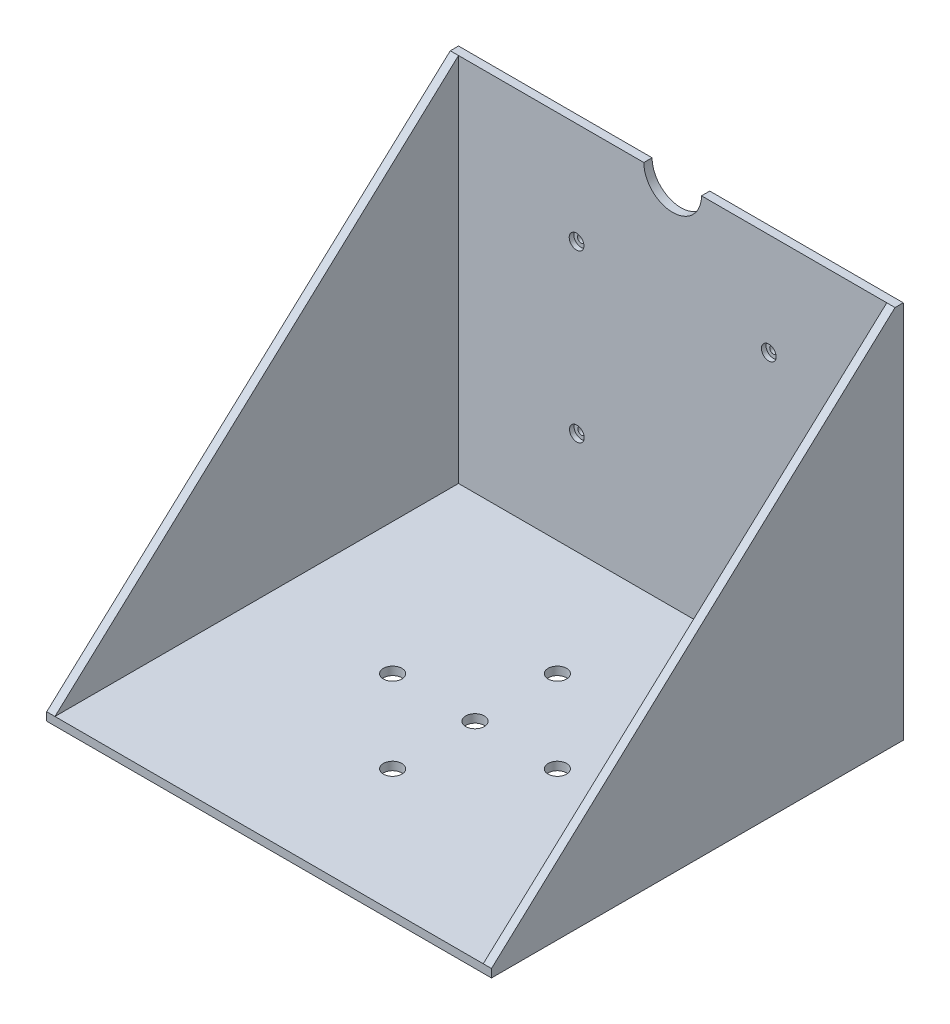
ISO-10303-21;
HEADER;
FILE_DESCRIPTION(('STEP AP214'),'2;1');
FILE_NAME('part.step','',(''),(''),'','','');
FILE_SCHEMA(('AUTOMOTIVE_DESIGN { 1 0 10303 214 1 1 1 1 }'));
ENDSEC;
DATA;
#1=APPLICATION_CONTEXT('core data for automotive mechanical design processes');
#2=APPLICATION_PROTOCOL_DEFINITION('international standard','automotive_design',2000,#1);
#3=PRODUCT_CONTEXT('',#1,'mechanical');
#4=PRODUCT('Part','Part','',(#3));
#5=PRODUCT_RELATED_PRODUCT_CATEGORY('part','',(#4));
#6=PRODUCT_DEFINITION_FORMATION('','',#4);
#7=PRODUCT_DEFINITION_CONTEXT('part definition',#1,'design');
#8=PRODUCT_DEFINITION('design','',#6,#7);
#9=PRODUCT_DEFINITION_SHAPE('','',#8);
#10=(LENGTH_UNIT() NAMED_UNIT(*) SI_UNIT(.MILLI.,.METRE.));
#11=(NAMED_UNIT(*) PLANE_ANGLE_UNIT() SI_UNIT($,.RADIAN.));
#12=(NAMED_UNIT(*) SI_UNIT($,.STERADIAN.) SOLID_ANGLE_UNIT());
#13=UNCERTAINTY_MEASURE_WITH_UNIT(LENGTH_MEASURE(1.E-05),#10,'distance_accuracy_value','');
#14=(GEOMETRIC_REPRESENTATION_CONTEXT(3) GLOBAL_UNCERTAINTY_ASSIGNED_CONTEXT((#13)) GLOBAL_UNIT_ASSIGNED_CONTEXT((#10,
#11,#12)) REPRESENTATION_CONTEXT('',''));
#15=CARTESIAN_POINT('',(0.,0.,0.));
#16=DIRECTION('',(0.,0.,1.));
#17=DIRECTION('',(1.,0.,0.));
#18=AXIS2_PLACEMENT_3D('',#15,#16,#17);
#19=CARTESIAN_POINT('',(0.,2.,0.));
#20=DIRECTION('',(0.,1.,0.));
#21=DIRECTION('',(0.,0.,1.));
#22=AXIS2_PLACEMENT_3D('',#19,#20,#21);
#23=PLANE('',#22);
#24=CARTESIAN_POINT('',(0.,2.,-20.));
#25=DIRECTION('',(0.,1.,0.));
#26=DIRECTION('',(0.,0.,1.));
#27=AXIS2_PLACEMENT_3D('',#24,#25,#26);
#28=CIRCLE('',#27,2.24999999999999);
#29=CARTESIAN_POINT('',(0.,2.,-17.75));
#30=VERTEX_POINT('',#29);
#31=EDGE_CURVE('E164',#30,#30,#28,.T.);
#32=ORIENTED_EDGE('',*,*,#31,.F.);
#33=EDGE_LOOP('',(#32));
#34=FACE_BOUND('',#33,.T.);
#35=CARTESIAN_POINT('',(20.,2.,0.));
#36=DIRECTION('',(0.,1.,0.));
#37=DIRECTION('',(0.,0.,1.));
#38=AXIS2_PLACEMENT_3D('',#35,#36,#37);
#39=CIRCLE('',#38,2.24999999999999);
#40=CARTESIAN_POINT('',(20.,2.,2.24999999999999));
#41=VERTEX_POINT('',#40);
#42=EDGE_CURVE('E170',#41,#41,#39,.T.);
#43=ORIENTED_EDGE('',*,*,#42,.F.);
#44=EDGE_LOOP('',(#43));
#45=FACE_BOUND('',#44,.T.);
#46=CARTESIAN_POINT('',(0.,2.,20.));
#47=DIRECTION('',(0.,1.,0.));
#48=DIRECTION('',(0.,0.,1.));
#49=AXIS2_PLACEMENT_3D('',#46,#47,#48);
#50=CIRCLE('',#49,2.24999999999999);
#51=CARTESIAN_POINT('',(0.,2.,22.25));
#52=VERTEX_POINT('',#51);
#53=EDGE_CURVE('E176',#52,#52,#50,.T.);
#54=ORIENTED_EDGE('',*,*,#53,.F.);
#55=EDGE_LOOP('',(#54));
#56=FACE_BOUND('',#55,.T.);
#57=CARTESIAN_POINT('',(-20.,2.,0.));
#58=DIRECTION('',(0.,1.,0.));
#59=DIRECTION('',(0.,0.,1.));
#60=AXIS2_PLACEMENT_3D('',#57,#58,#59);
#61=CIRCLE('',#60,2.24999999999999);
#62=CARTESIAN_POINT('',(-20.,2.,2.24999999999999));
#63=VERTEX_POINT('',#62);
#64=EDGE_CURVE('E182',#63,#63,#61,.T.);
#65=ORIENTED_EDGE('',*,*,#64,.F.);
#66=EDGE_LOOP('',(#65));
#67=FACE_BOUND('',#66,.T.);
#68=CARTESIAN_POINT('',(0.,2.,0.));
#69=DIRECTION('',(0.,1.,0.));
#70=DIRECTION('',(0.,0.,1.));
#71=AXIS2_PLACEMENT_3D('',#68,#69,#70);
#72=CIRCLE('',#71,2.24999999999999);
#73=CARTESIAN_POINT('',(0.,2.,2.24999999999999));
#74=VERTEX_POINT('',#73);
#75=EDGE_CURVE('E186',#74,#74,#72,.T.);
#76=ORIENTED_EDGE('',*,*,#75,.F.);
#77=EDGE_LOOP('',(#76));
#78=FACE_BOUND('',#77,.T.);
#79=DIRECTION('',(-1.,0.,0.));
#80=VECTOR('',#79,1.);
#81=CARTESIAN_POINT('',(0.,2.,-48.));
#82=LINE('',#81,#80);
#83=CARTESIAN_POINT('',(52.,2.,-48.));
#84=VERTEX_POINT('',#83);
#85=CARTESIAN_POINT('',(-52.,2.,-48.));
#86=VERTEX_POINT('',#85);
#87=EDGE_CURVE('E138',#84,#86,#82,.T.);
#88=ORIENTED_EDGE('',*,*,#87,.T.);
#89=DIRECTION('',(0.,0.,1.));
#90=VECTOR('',#89,1.);
#91=CARTESIAN_POINT('',(-52.,2.,50.));
#92=LINE('',#91,#90);
#93=CARTESIAN_POINT('',(-52.,2.,50.));
#94=VERTEX_POINT('',#93);
#95=EDGE_CURVE('E60',#86,#94,#92,.T.);
#96=ORIENTED_EDGE('',*,*,#95,.T.);
#97=DIRECTION('',(1.,0.,0.));
#98=VECTOR('',#97,1.);
#99=CARTESIAN_POINT('',(54.,2.,50.));
#100=LINE('',#99,#98);
#101=CARTESIAN_POINT('',(52.,2.,50.));
#102=VERTEX_POINT('',#101);
#103=EDGE_CURVE('E206',#94,#102,#100,.T.);
#104=ORIENTED_EDGE('',*,*,#103,.T.);
#105=DIRECTION('',(0.,0.,-1.));
#106=VECTOR('',#105,1.);
#107=CARTESIAN_POINT('',(52.,2.,50.));
#108=LINE('',#107,#106);
#109=EDGE_CURVE('E152',#102,#84,#108,.T.);
#110=ORIENTED_EDGE('',*,*,#109,.T.);
#111=EDGE_LOOP('',(#88,#96,#104,#110));
#112=FACE_BOUND('',#111,.T.);
#113=ADVANCED_FACE('F43',(#34,#45,#56,#67,#78,#112),#23,.T.);
#114=CARTESIAN_POINT('',(0.,92.,-48.));
#115=DIRECTION('',(0.,0.,1.));
#116=DIRECTION('',(1.,0.,0.));
#117=AXIS2_PLACEMENT_3D('',#114,#115,#116);
#118=PLANE('',#117);
#119=CARTESIAN_POINT('',(-23.3352416469861,67.1939591175841,-48.));
#120=DIRECTION('',(0.,0.,1.));
#121=DIRECTION('',(1.,0.,0.));
#122=AXIS2_PLACEMENT_3D('',#119,#120,#121);
#123=CIRCLE('',#122,1.78561999999999);
#124=CARTESIAN_POINT('',(-21.5496216469861,67.1939591175841,-48.));
#125=VERTEX_POINT('',#124);
#126=EDGE_CURVE('E615',#125,#125,#123,.T.);
#127=ORIENTED_EDGE('',*,*,#126,.F.);
#128=EDGE_LOOP('',(#127));
#129=FACE_BOUND('',#128,.T.);
#130=CARTESIAN_POINT('',(23.3407645603034,67.198738561801,-48.));
#131=DIRECTION('',(0.,0.,1.));
#132=DIRECTION('',(1.,0.,0.));
#133=AXIS2_PLACEMENT_3D('',#130,#131,#132);
#134=CIRCLE('',#133,1.78561999999999);
#135=CARTESIAN_POINT('',(25.1263845603034,67.198738561801,-48.));
#136=VERTEX_POINT('',#135);
#137=EDGE_CURVE('E253',#136,#136,#134,.T.);
#138=ORIENTED_EDGE('',*,*,#137,.F.);
#139=EDGE_LOOP('',(#138));
#140=FACE_BOUND('',#139,.T.);
#141=CARTESIAN_POINT('',(-23.269344276744,26.8630674528177,-48.));
#142=DIRECTION('',(0.,0.,1.));
#143=DIRECTION('',(1.,0.,0.));
#144=AXIS2_PLACEMENT_3D('',#141,#142,#143);
#145=CIRCLE('',#144,1.78561999999999);
#146=CARTESIAN_POINT('',(-21.483724276744,26.8630674528177,-48.));
#147=VERTEX_POINT('',#146);
#148=EDGE_CURVE('E240',#147,#147,#145,.T.);
#149=ORIENTED_EDGE('',*,*,#148,.F.);
#150=EDGE_LOOP('',(#149));
#151=FACE_BOUND('',#150,.T.);
#152=CARTESIAN_POINT('',(23.1813509487763,26.9392155250974,-48.));
#153=DIRECTION('',(0.,0.,1.));
#154=DIRECTION('',(1.,0.,0.));
#155=AXIS2_PLACEMENT_3D('',#152,#153,#154);
#156=CIRCLE('',#155,1.78561999999999);
#157=CARTESIAN_POINT('',(24.9669709487763,26.9392155250974,-48.));
#158=VERTEX_POINT('',#157);
#159=EDGE_CURVE('E236',#158,#158,#156,.T.);
#160=ORIENTED_EDGE('',*,*,#159,.F.);
#161=EDGE_LOOP('',(#160));
#162=FACE_BOUND('',#161,.T.);
#163=DIRECTION('',(-1.,0.,0.));
#164=VECTOR('',#163,1.);
#165=CARTESIAN_POINT('',(0.,92.,-48.));
#166=LINE('',#165,#164);
#167=CARTESIAN_POINT('',(-7.,92.,-48.));
#168=VERTEX_POINT('',#167);
#169=CARTESIAN_POINT('',(-52.,92.,-48.));
#170=VERTEX_POINT('',#169);
#171=EDGE_CURVE('E133',#168,#170,#166,.T.);
#172=ORIENTED_EDGE('',*,*,#171,.T.);
#173=DIRECTION('',(0.,-1.,0.));
#174=VECTOR('',#173,1.);
#175=CARTESIAN_POINT('',(-52.,2.,-48.));
#176=LINE('',#175,#174);
#177=EDGE_CURVE('E68',#170,#86,#176,.T.);
#178=ORIENTED_EDGE('',*,*,#177,.T.);
#179=ORIENTED_EDGE('',*,*,#87,.F.);
#180=DIRECTION('',(0.,1.,0.));
#181=VECTOR('',#180,1.);
#182=CARTESIAN_POINT('',(52.,2.,-48.));
#183=LINE('',#182,#181);
#184=CARTESIAN_POINT('',(52.,92.,-48.));
#185=VERTEX_POINT('',#184);
#186=EDGE_CURVE('E136',#84,#185,#183,.T.);
#187=ORIENTED_EDGE('',*,*,#186,.T.);
#188=CARTESIAN_POINT('',(7.,92.,-48.));
#189=VERTEX_POINT('',#188);
#190=EDGE_CURVE('E123',#185,#189,#166,.T.);
#191=ORIENTED_EDGE('',*,*,#190,.T.);
#192=CARTESIAN_POINT('',(0.,92.,-48.));
#193=DIRECTION('',(0.,0.,1.));
#194=DIRECTION('',(1.,0.,0.));
#195=AXIS2_PLACEMENT_3D('',#192,#193,#194);
#196=CIRCLE('',#195,7.);
#197=EDGE_CURVE('E189',#168,#189,#196,.T.);
#198=ORIENTED_EDGE('',*,*,#197,.F.);
#199=EDGE_LOOP('',(#172,#178,#179,#187,#191,#198));
#200=FACE_BOUND('',#199,.T.);
#201=ADVANCED_FACE('F137',(#129,#140,#151,#162,#200),#118,.T.);
#202=CARTESIAN_POINT('',(0.,92.,0.));
#203=DIRECTION('',(0.,1.,0.));
#204=DIRECTION('',(0.,0.,1.));
#205=AXIS2_PLACEMENT_3D('',#202,#203,#204);
#206=PLANE('',#205);
#207=DIRECTION('',(0.,0.,1.));
#208=VECTOR('',#207,1.);
#209=CARTESIAN_POINT('',(-7.,92.,-138.));
#210=LINE('',#209,#208);
#211=CARTESIAN_POINT('',(-7.,92.,-50.));
#212=VERTEX_POINT('',#211);
#213=EDGE_CURVE('E11',#212,#168,#210,.T.);
#214=ORIENTED_EDGE('',*,*,#213,.F.);
#215=DIRECTION('',(-1.,0.,0.));
#216=VECTOR('',#215,1.);
#217=CARTESIAN_POINT('',(0.,92.,-50.));
#218=LINE('',#217,#216);
#219=CARTESIAN_POINT('',(-54.,92.,-50.));
#220=VERTEX_POINT('',#219);
#221=EDGE_CURVE('E195',#212,#220,#218,.T.);
#222=ORIENTED_EDGE('',*,*,#221,.T.);
#223=DIRECTION('',(0.,0.,1.));
#224=VECTOR('',#223,1.);
#225=CARTESIAN_POINT('',(-54.,92.,0.));
#226=LINE('',#225,#224);
#227=CARTESIAN_POINT('',(-54.,92.,-48.));
#228=VERTEX_POINT('',#227);
#229=EDGE_CURVE('E198',#220,#228,#226,.T.);
#230=ORIENTED_EDGE('',*,*,#229,.T.);
#231=DIRECTION('',(-1.,0.,0.));
#232=VECTOR('',#231,1.);
#233=CARTESIAN_POINT('',(-52.,92.,-48.));
#234=LINE('',#233,#232);
#235=EDGE_CURVE('E159',#170,#228,#234,.T.);
#236=ORIENTED_EDGE('',*,*,#235,.F.);
#237=ORIENTED_EDGE('',*,*,#171,.F.);
#238=EDGE_LOOP('',(#214,#222,#230,#236,#237));
#239=FACE_BOUND('',#238,.T.);
#240=ADVANCED_FACE('F309',(#239),#206,.T.);
#241=CARTESIAN_POINT('',(-54.,2.,50.));
#242=DIRECTION('',(1.,0.,0.));
#243=DIRECTION('',(0.,0.,-1.));
#244=AXIS2_PLACEMENT_3D('',#241,#242,#243);
#245=PLANE('',#244);
#246=DIRECTION('',(0.,-1.,0.));
#247=VECTOR('',#246,1.);
#248=CARTESIAN_POINT('',(-54.,2.,50.));
#249=LINE('',#248,#247);
#250=CARTESIAN_POINT('',(-54.,2.,50.));
#251=VERTEX_POINT('',#250);
#252=CARTESIAN_POINT('',(-54.,0.,50.));
#253=VERTEX_POINT('',#252);
#254=EDGE_CURVE('E223',#251,#253,#249,.T.);
#255=ORIENTED_EDGE('',*,*,#254,.F.);
#256=DIRECTION('',(0.,0.676404999576679,-0.736529888427939));
#257=VECTOR('',#256,1.);
#258=CARTESIAN_POINT('',(-54.,92.,-48.));
#259=LINE('',#258,#257);
#260=EDGE_CURVE('E232',#251,#228,#259,.T.);
#261=ORIENTED_EDGE('',*,*,#260,.T.);
#262=ORIENTED_EDGE('',*,*,#229,.F.);
#263=DIRECTION('',(0.,-1.,0.));
#264=VECTOR('',#263,1.);
#265=CARTESIAN_POINT('',(-54.,2.,-50.));
#266=LINE('',#265,#264);
#267=CARTESIAN_POINT('',(-54.,0.,-50.));
#268=VERTEX_POINT('',#267);
#269=EDGE_CURVE('E205',#220,#268,#266,.T.);
#270=ORIENTED_EDGE('',*,*,#269,.T.);
#271=DIRECTION('',(0.,0.,1.));
#272=VECTOR('',#271,1.);
#273=CARTESIAN_POINT('',(-54.,0.,50.));
#274=LINE('',#273,#272);
#275=EDGE_CURVE('E200',#268,#253,#274,.T.);
#276=ORIENTED_EDGE('',*,*,#275,.T.);
#277=EDGE_LOOP('',(#255,#261,#262,#270,#276));
#278=FACE_BOUND('',#277,.T.);
#279=ADVANCED_FACE('F45',(#278),#245,.F.);
#280=CARTESIAN_POINT('',(54.,2.,50.));
#281=DIRECTION('',(0.,0.,-1.));
#282=DIRECTION('',(-1.,0.,0.));
#283=AXIS2_PLACEMENT_3D('',#280,#281,#282);
#284=PLANE('',#283);
#285=DIRECTION('',(1.,0.,0.));
#286=VECTOR('',#285,1.);
#287=CARTESIAN_POINT('',(54.,0.,50.));
#288=LINE('',#287,#286);
#289=CARTESIAN_POINT('',(54.,0.,50.));
#290=VERTEX_POINT('',#289);
#291=EDGE_CURVE('E209',#253,#290,#288,.T.);
#292=ORIENTED_EDGE('',*,*,#291,.T.);
#293=DIRECTION('',(0.,-1.,0.));
#294=VECTOR('',#293,1.);
#295=CARTESIAN_POINT('',(54.,2.,50.));
#296=LINE('',#295,#294);
#297=CARTESIAN_POINT('',(54.,2.,50.));
#298=VERTEX_POINT('',#297);
#299=EDGE_CURVE('E220',#298,#290,#296,.T.);
#300=ORIENTED_EDGE('',*,*,#299,.F.);
#301=DIRECTION('',(1.,0.,0.));
#302=VECTOR('',#301,1.);
#303=CARTESIAN_POINT('',(52.,2.,50.));
#304=LINE('',#303,#302);
#305=EDGE_CURVE('E154',#102,#298,#304,.T.);
#306=ORIENTED_EDGE('',*,*,#305,.F.);
#307=ORIENTED_EDGE('',*,*,#103,.F.);
#308=EDGE_CURVE('E202',#251,#94,#100,.T.);
#309=ORIENTED_EDGE('',*,*,#308,.F.);
#310=ORIENTED_EDGE('',*,*,#254,.T.);
#311=EDGE_LOOP('',(#292,#300,#306,#307,#309,#310));
#312=FACE_BOUND('',#311,.T.);
#313=ADVANCED_FACE('F286',(#312),#284,.F.);
#314=CARTESIAN_POINT('',(54.,2.,50.));
#315=DIRECTION('',(-1.,0.,0.));
#316=DIRECTION('',(0.,0.,1.));
#317=AXIS2_PLACEMENT_3D('',#314,#315,#316);
#318=PLANE('',#317);
#319=DIRECTION('',(0.,0.,-1.));
#320=VECTOR('',#319,1.);
#321=CARTESIAN_POINT('',(54.,0.,50.));
#322=LINE('',#321,#320);
#323=CARTESIAN_POINT('',(54.,0.,-50.));
#324=VERTEX_POINT('',#323);
#325=EDGE_CURVE('E211',#290,#324,#322,.T.);
#326=ORIENTED_EDGE('',*,*,#325,.T.);
#327=DIRECTION('',(0.,-1.,0.));
#328=VECTOR('',#327,1.);
#329=CARTESIAN_POINT('',(54.,2.,-50.));
#330=LINE('',#329,#328);
#331=CARTESIAN_POINT('',(54.,92.,-50.));
#332=VERTEX_POINT('',#331);
#333=EDGE_CURVE('E217',#332,#324,#330,.T.);
#334=ORIENTED_EDGE('',*,*,#333,.F.);
#335=DIRECTION('',(0.,0.,-1.));
#336=VECTOR('',#335,1.);
#337=CARTESIAN_POINT('',(54.,92.,0.));
#338=LINE('',#337,#336);
#339=CARTESIAN_POINT('',(54.,92.,-48.));
#340=VERTEX_POINT('',#339);
#341=EDGE_CURVE('E150',#340,#332,#338,.T.);
#342=ORIENTED_EDGE('',*,*,#341,.F.);
#343=DIRECTION('',(0.,-0.676404999576679,0.736529888427939));
#344=VECTOR('',#343,1.);
#345=CARTESIAN_POINT('',(54.,92.,-48.));
#346=LINE('',#345,#344);
#347=EDGE_CURVE('E143',#340,#298,#346,.T.);
#348=ORIENTED_EDGE('',*,*,#347,.T.);
#349=ORIENTED_EDGE('',*,*,#299,.T.);
#350=EDGE_LOOP('',(#326,#334,#342,#348,#349));
#351=FACE_BOUND('',#350,.T.);
#352=ADVANCED_FACE('F323',(#351),#318,.F.);
#353=CARTESIAN_POINT('',(54.,2.,-50.));
#354=DIRECTION('',(0.,0.,1.));
#355=DIRECTION('',(1.,0.,0.));
#356=AXIS2_PLACEMENT_3D('',#353,#354,#355);
#357=PLANE('',#356);
#358=CARTESIAN_POINT('',(-23.3352416469861,67.1939591175841,-50.));
#359=DIRECTION('',(0.,0.,1.));
#360=DIRECTION('',(1.,0.,0.));
#361=AXIS2_PLACEMENT_3D('',#358,#359,#360);
#362=CIRCLE('',#361,0.888999999999997);
#363=CARTESIAN_POINT('',(-22.4462416469861,67.1939591175841,-50.));
#364=VERTEX_POINT('',#363);
#365=EDGE_CURVE('E47',#364,#364,#362,.T.);
#366=ORIENTED_EDGE('',*,*,#365,.T.);
#367=EDGE_LOOP('',(#366));
#368=FACE_BOUND('',#367,.T.);
#369=CARTESIAN_POINT('',(23.3407645603034,67.198738561801,-50.));
#370=DIRECTION('',(0.,0.,1.));
#371=DIRECTION('',(1.,0.,0.));
#372=AXIS2_PLACEMENT_3D('',#369,#370,#371);
#373=CIRCLE('',#372,0.888999999999997);
#374=CARTESIAN_POINT('',(24.2297645603034,67.198738561801,-50.));
#375=VERTEX_POINT('',#374);
#376=EDGE_CURVE('E238',#375,#375,#373,.T.);
#377=ORIENTED_EDGE('',*,*,#376,.T.);
#378=EDGE_LOOP('',(#377));
#379=FACE_BOUND('',#378,.T.);
#380=CARTESIAN_POINT('',(-23.269344276744,26.8630674528177,-50.));
#381=DIRECTION('',(0.,0.,1.));
#382=DIRECTION('',(1.,0.,0.));
#383=AXIS2_PLACEMENT_3D('',#380,#381,#382);
#384=CIRCLE('',#383,0.888999999999997);
#385=CARTESIAN_POINT('',(-22.380344276744,26.8630674528177,-50.));
#386=VERTEX_POINT('',#385);
#387=EDGE_CURVE('E234',#386,#386,#384,.T.);
#388=ORIENTED_EDGE('',*,*,#387,.T.);
#389=EDGE_LOOP('',(#388));
#390=FACE_BOUND('',#389,.T.);
#391=CARTESIAN_POINT('',(23.1813509487763,26.9392155250974,-50.));
#392=DIRECTION('',(0.,0.,1.));
#393=DIRECTION('',(1.,0.,0.));
#394=AXIS2_PLACEMENT_3D('',#391,#392,#393);
#395=CIRCLE('',#394,0.888999999999997);
#396=CARTESIAN_POINT('',(24.0703509487763,26.9392155250974,-50.));
#397=VERTEX_POINT('',#396);
#398=EDGE_CURVE('E229',#397,#397,#395,.T.);
#399=ORIENTED_EDGE('',*,*,#398,.T.);
#400=EDGE_LOOP('',(#399));
#401=FACE_BOUND('',#400,.T.);
#402=ORIENTED_EDGE('',*,*,#221,.F.);
#403=CARTESIAN_POINT('',(0.,92.,-50.));
#404=DIRECTION('',(0.,0.,1.));
#405=DIRECTION('',(1.,0.,0.));
#406=AXIS2_PLACEMENT_3D('',#403,#404,#405);
#407=CIRCLE('',#406,7.);
#408=CARTESIAN_POINT('',(7.,92.,-50.));
#409=VERTEX_POINT('',#408);
#410=EDGE_CURVE('E191',#212,#409,#407,.T.);
#411=ORIENTED_EDGE('',*,*,#410,.T.);
#412=EDGE_CURVE('E196',#332,#409,#218,.T.);
#413=ORIENTED_EDGE('',*,*,#412,.F.);
#414=ORIENTED_EDGE('',*,*,#333,.T.);
#415=DIRECTION('',(-1.,0.,0.));
#416=VECTOR('',#415,1.);
#417=CARTESIAN_POINT('',(54.,0.,-50.));
#418=LINE('',#417,#416);
#419=EDGE_CURVE('E213',#324,#268,#418,.T.);
#420=ORIENTED_EDGE('',*,*,#419,.T.);
#421=ORIENTED_EDGE('',*,*,#269,.F.);
#422=EDGE_LOOP('',(#402,#411,#413,#414,#420,#421));
#423=FACE_BOUND('',#422,.T.);
#424=ADVANCED_FACE('F319',(#368,#379,#390,#401,#423),#357,.F.);
#425=CARTESIAN_POINT('',(0.,0.,0.));
#426=DIRECTION('',(0.,1.,0.));
#427=DIRECTION('',(0.,0.,1.));
#428=AXIS2_PLACEMENT_3D('',#425,#426,#427);
#429=PLANE('',#428);
#430=CARTESIAN_POINT('',(0.,0.,-20.));
#431=DIRECTION('',(0.,-1.,0.));
#432=DIRECTION('',(0.,0.,-1.));
#433=AXIS2_PLACEMENT_3D('',#430,#431,#432);
#434=CIRCLE('',#433,2.24999999999999);
#435=CARTESIAN_POINT('',(0.,0.,-22.25));
#436=VERTEX_POINT('',#435);
#437=EDGE_CURVE('E161',#436,#436,#434,.T.);
#438=ORIENTED_EDGE('',*,*,#437,.F.);
#439=EDGE_LOOP('',(#438));
#440=FACE_BOUND('',#439,.T.);
#441=CARTESIAN_POINT('',(20.,0.,0.));
#442=DIRECTION('',(0.,-1.,0.));
#443=DIRECTION('',(0.,0.,-1.));
#444=AXIS2_PLACEMENT_3D('',#441,#442,#443);
#445=CIRCLE('',#444,2.24999999999999);
#446=CARTESIAN_POINT('',(20.,0.,-2.24999999999999));
#447=VERTEX_POINT('',#446);
#448=EDGE_CURVE('E167',#447,#447,#445,.T.);
#449=ORIENTED_EDGE('',*,*,#448,.F.);
#450=EDGE_LOOP('',(#449));
#451=FACE_BOUND('',#450,.T.);
#452=CARTESIAN_POINT('',(0.,0.,20.));
#453=DIRECTION('',(0.,-1.,0.));
#454=DIRECTION('',(0.,0.,-1.));
#455=AXIS2_PLACEMENT_3D('',#452,#453,#454);
#456=CIRCLE('',#455,2.24999999999999);
#457=CARTESIAN_POINT('',(0.,0.,17.75));
#458=VERTEX_POINT('',#457);
#459=EDGE_CURVE('E173',#458,#458,#456,.T.);
#460=ORIENTED_EDGE('',*,*,#459,.F.);
#461=EDGE_LOOP('',(#460));
#462=FACE_BOUND('',#461,.T.);
#463=CARTESIAN_POINT('',(-20.,0.,0.));
#464=DIRECTION('',(0.,-1.,0.));
#465=DIRECTION('',(0.,0.,-1.));
#466=AXIS2_PLACEMENT_3D('',#463,#464,#465);
#467=CIRCLE('',#466,2.24999999999999);
#468=CARTESIAN_POINT('',(-20.,0.,-2.24999999999999));
#469=VERTEX_POINT('',#468);
#470=EDGE_CURVE('E179',#469,#469,#467,.T.);
#471=ORIENTED_EDGE('',*,*,#470,.F.);
#472=EDGE_LOOP('',(#471));
#473=FACE_BOUND('',#472,.T.);
#474=CARTESIAN_POINT('',(0.,0.,0.));
#475=DIRECTION('',(0.,-1.,0.));
#476=DIRECTION('',(0.,0.,-1.));
#477=AXIS2_PLACEMENT_3D('',#474,#475,#476);
#478=CIRCLE('',#477,2.24999999999999);
#479=CARTESIAN_POINT('',(0.,0.,-2.24999999999999));
#480=VERTEX_POINT('',#479);
#481=EDGE_CURVE('E183',#480,#480,#478,.T.);
#482=ORIENTED_EDGE('',*,*,#481,.F.);
#483=EDGE_LOOP('',(#482));
#484=FACE_BOUND('',#483,.T.);
#485=ORIENTED_EDGE('',*,*,#275,.F.);
#486=ORIENTED_EDGE('',*,*,#419,.F.);
#487=ORIENTED_EDGE('',*,*,#325,.F.);
#488=ORIENTED_EDGE('',*,*,#291,.F.);
#489=EDGE_LOOP('',(#485,#486,#487,#488));
#490=FACE_BOUND('',#489,.T.);
#491=ADVANCED_FACE('F316',(#440,#451,#462,#473,#484,#490),#429,.F.);
#492=DIRECTION('',(0.,0.,1.));
#493=VECTOR('',#492,1.);
#494=CARTESIAN_POINT('',(7.,92.,-138.));
#495=LINE('',#494,#493);
#496=EDGE_CURVE('E52',#189,#409,#495,.F.);
#497=ORIENTED_EDGE('',*,*,#496,.F.);
#498=ORIENTED_EDGE('',*,*,#190,.F.);
#499=EDGE_CURVE('E128',#340,#185,#166,.T.);
#500=ORIENTED_EDGE('',*,*,#499,.F.);
#501=ORIENTED_EDGE('',*,*,#341,.T.);
#502=ORIENTED_EDGE('',*,*,#412,.T.);
#503=EDGE_LOOP('',(#497,#498,#500,#501,#502));
#504=FACE_BOUND('',#503,.T.);
#505=ADVANCED_FACE('F125',(#504),#206,.T.);
#506=CARTESIAN_POINT('',(0.,92.,-138.));
#507=DIRECTION('',(0.,0.,1.));
#508=DIRECTION('',(1.,0.,0.));
#509=AXIS2_PLACEMENT_3D('',#506,#507,#508);
#510=CYLINDRICAL_SURFACE('',#509,7.);
#511=ORIENTED_EDGE('',*,*,#213,.T.);
#512=ORIENTED_EDGE('',*,*,#197,.T.);
#513=ORIENTED_EDGE('',*,*,#496,.T.);
#514=ORIENTED_EDGE('',*,*,#410,.F.);
#515=EDGE_LOOP('',(#511,#512,#513,#514));
#516=FACE_BOUND('',#515,.T.);
#517=ADVANCED_FACE('F338',(#516),#510,.F.);
#518=CARTESIAN_POINT('',(0.,0.,0.));
#519=DIRECTION('',(0.,-1.,0.));
#520=DIRECTION('',(0.,0.,-1.));
#521=AXIS2_PLACEMENT_3D('',#518,#519,#520);
#522=CYLINDRICAL_SURFACE('',#521,2.24999999999999);
#523=ORIENTED_EDGE('',*,*,#75,.T.);
#524=EDGE_LOOP('',(#523));
#525=FACE_BOUND('',#524,.T.);
#526=ORIENTED_EDGE('',*,*,#481,.T.);
#527=EDGE_LOOP('',(#526));
#528=FACE_BOUND('',#527,.T.);
#529=ADVANCED_FACE('F343',(#525,#528),#522,.F.);
#530=CARTESIAN_POINT('',(-20.,0.,0.));
#531=DIRECTION('',(0.,-1.,0.));
#532=DIRECTION('',(0.,0.,-1.));
#533=AXIS2_PLACEMENT_3D('',#530,#531,#532);
#534=CYLINDRICAL_SURFACE('',#533,2.24999999999999);
#535=ORIENTED_EDGE('',*,*,#64,.T.);
#536=EDGE_LOOP('',(#535));
#537=FACE_BOUND('',#536,.T.);
#538=ORIENTED_EDGE('',*,*,#470,.T.);
#539=EDGE_LOOP('',(#538));
#540=FACE_BOUND('',#539,.T.);
#541=ADVANCED_FACE('F348',(#537,#540),#534,.F.);
#542=CARTESIAN_POINT('',(0.,0.,20.));
#543=DIRECTION('',(0.,-1.,0.));
#544=DIRECTION('',(0.,0.,-1.));
#545=AXIS2_PLACEMENT_3D('',#542,#543,#544);
#546=CYLINDRICAL_SURFACE('',#545,2.24999999999999);
#547=ORIENTED_EDGE('',*,*,#53,.T.);
#548=EDGE_LOOP('',(#547));
#549=FACE_BOUND('',#548,.T.);
#550=ORIENTED_EDGE('',*,*,#459,.T.);
#551=EDGE_LOOP('',(#550));
#552=FACE_BOUND('',#551,.T.);
#553=ADVANCED_FACE('F354',(#549,#552),#546,.F.);
#554=CARTESIAN_POINT('',(20.,0.,0.));
#555=DIRECTION('',(0.,-1.,0.));
#556=DIRECTION('',(0.,0.,-1.));
#557=AXIS2_PLACEMENT_3D('',#554,#555,#556);
#558=CYLINDRICAL_SURFACE('',#557,2.24999999999999);
#559=ORIENTED_EDGE('',*,*,#42,.T.);
#560=EDGE_LOOP('',(#559));
#561=FACE_BOUND('',#560,.T.);
#562=ORIENTED_EDGE('',*,*,#448,.T.);
#563=EDGE_LOOP('',(#562));
#564=FACE_BOUND('',#563,.T.);
#565=ADVANCED_FACE('F358',(#561,#564),#558,.F.);
#566=CARTESIAN_POINT('',(0.,0.,-20.));
#567=DIRECTION('',(0.,-1.,0.));
#568=DIRECTION('',(0.,0.,-1.));
#569=AXIS2_PLACEMENT_3D('',#566,#567,#568);
#570=CYLINDRICAL_SURFACE('',#569,2.24999999999999);
#571=ORIENTED_EDGE('',*,*,#31,.T.);
#572=EDGE_LOOP('',(#571));
#573=FACE_BOUND('',#572,.T.);
#574=ORIENTED_EDGE('',*,*,#437,.T.);
#575=EDGE_LOOP('',(#574));
#576=FACE_BOUND('',#575,.T.);
#577=ADVANCED_FACE('F362',(#573,#576),#570,.F.);
#578=CARTESIAN_POINT('',(52.,92.,-48.));
#579=DIRECTION('',(0.,0.736529888427939,0.676404999576679));
#580=DIRECTION('',(0.,-0.676404999576679,0.736529888427939));
#581=AXIS2_PLACEMENT_3D('',#578,#579,#580);
#582=PLANE('',#581);
#583=ORIENTED_EDGE('',*,*,#347,.F.);
#584=ORIENTED_EDGE('',*,*,#499,.T.);
#585=DIRECTION('',(0.,-0.676404999576679,0.736529888427939));
#586=VECTOR('',#585,1.);
#587=CARTESIAN_POINT('',(52.,92.,-48.));
#588=LINE('',#587,#586);
#589=EDGE_CURVE('E142',#185,#102,#588,.T.);
#590=ORIENTED_EDGE('',*,*,#589,.T.);
#591=ORIENTED_EDGE('',*,*,#305,.T.);
#592=EDGE_LOOP('',(#583,#584,#590,#591));
#593=FACE_BOUND('',#592,.T.);
#594=ADVANCED_FACE('F147',(#593),#582,.T.);
#595=CARTESIAN_POINT('',(52.,0.,0.));
#596=DIRECTION('',(-1.,0.,0.));
#597=DIRECTION('',(0.,0.,1.));
#598=AXIS2_PLACEMENT_3D('',#595,#596,#597);
#599=PLANE('',#598);
#600=ORIENTED_EDGE('',*,*,#186,.F.);
#601=ORIENTED_EDGE('',*,*,#109,.F.);
#602=ORIENTED_EDGE('',*,*,#589,.F.);
#603=EDGE_LOOP('',(#600,#601,#602));
#604=FACE_BOUND('',#603,.T.);
#605=ADVANCED_FACE('F151',(#604),#599,.T.);
#606=CARTESIAN_POINT('',(-52.,92.,-48.));
#607=DIRECTION('',(0.,0.73652988842794,0.676404999576679));
#608=DIRECTION('',(0.,-0.676404999576679,0.736529888427939));
#609=AXIS2_PLACEMENT_3D('',#606,#607,#608);
#610=PLANE('',#609);
#611=ORIENTED_EDGE('',*,*,#260,.F.);
#612=ORIENTED_EDGE('',*,*,#308,.T.);
#613=DIRECTION('',(0.,0.676404999576679,-0.736529888427939));
#614=VECTOR('',#613,1.);
#615=CARTESIAN_POINT('',(-52.,92.,-48.));
#616=LINE('',#615,#614);
#617=EDGE_CURVE('E268',#94,#170,#616,.T.);
#618=ORIENTED_EDGE('',*,*,#617,.T.);
#619=ORIENTED_EDGE('',*,*,#235,.T.);
#620=EDGE_LOOP('',(#611,#612,#618,#619));
#621=FACE_BOUND('',#620,.T.);
#622=ADVANCED_FACE('F277',(#621),#610,.T.);
#623=CARTESIAN_POINT('',(-52.,0.,0.));
#624=DIRECTION('',(-1.,0.,0.));
#625=DIRECTION('',(0.,0.,1.));
#626=AXIS2_PLACEMENT_3D('',#623,#624,#625);
#627=PLANE('',#626);
#628=ORIENTED_EDGE('',*,*,#617,.F.);
#629=ORIENTED_EDGE('',*,*,#95,.F.);
#630=ORIENTED_EDGE('',*,*,#177,.F.);
#631=EDGE_LOOP('',(#628,#629,#630));
#632=FACE_BOUND('',#631,.T.);
#633=ADVANCED_FACE('F289',(#632),#627,.F.);
#634=CARTESIAN_POINT('',(23.1813509487763,26.9392155250974,-48.));
#635=DIRECTION('',(0.,0.,1.));
#636=DIRECTION('',(1.,0.,0.));
#637=AXIS2_PLACEMENT_3D('',#634,#635,#636);
#638=CYLINDRICAL_SURFACE('',#637,0.888999999999997);
#639=CARTESIAN_POINT('',(23.1813509487763,26.9392155250974,-49.1176));
#640=DIRECTION('',(0.,0.,1.));
#641=DIRECTION('',(1.,0.,0.));
#642=AXIS2_PLACEMENT_3D('',#639,#640,#641);
#643=CIRCLE('',#642,0.888999999999997);
#644=CARTESIAN_POINT('',(24.0703509487763,26.9392155250974,-49.1176));
#645=VERTEX_POINT('',#644);
#646=EDGE_CURVE('E233',#645,#645,#643,.T.);
#647=ORIENTED_EDGE('',*,*,#646,.T.);
#648=EDGE_LOOP('',(#647));
#649=FACE_BOUND('',#648,.T.);
#650=ORIENTED_EDGE('',*,*,#398,.F.);
#651=EDGE_LOOP('',(#650));
#652=FACE_BOUND('',#651,.T.);
#653=ADVANCED_FACE('F291',(#649,#652),#638,.F.);
#654=CARTESIAN_POINT('',(24.0703509487763,26.9392155250974,-49.1176));
#655=DIRECTION('',(0.,0.,-1.));
#656=DIRECTION('',(-1.,0.,0.));
#657=AXIS2_PLACEMENT_3D('',#654,#655,#656);
#658=PLANE('',#657);
#659=ORIENTED_EDGE('',*,*,#646,.F.);
#660=EDGE_LOOP('',(#659));
#661=FACE_BOUND('',#660,.T.);
#662=CARTESIAN_POINT('',(23.1813509487763,26.9392155250974,-49.1176));
#663=DIRECTION('',(0.,0.,1.));
#664=DIRECTION('',(1.,0.,0.));
#665=AXIS2_PLACEMENT_3D('',#662,#663,#664);
#666=CIRCLE('',#665,1.78561999999999);
#667=CARTESIAN_POINT('',(24.9669709487763,26.9392155250974,-49.1176));
#668=VERTEX_POINT('',#667);
#669=EDGE_CURVE('E263',#668,#668,#666,.T.);
#670=ORIENTED_EDGE('',*,*,#669,.T.);
#671=EDGE_LOOP('',(#670));
#672=FACE_BOUND('',#671,.T.);
#673=ADVANCED_FACE('F298',(#661,#672),#658,.F.);
#674=CARTESIAN_POINT('',(23.1813509487763,26.9392155250974,-48.));
#675=DIRECTION('',(0.,0.,1.));
#676=DIRECTION('',(1.,0.,0.));
#677=AXIS2_PLACEMENT_3D('',#674,#675,#676);
#678=CYLINDRICAL_SURFACE('',#677,1.78561999999999);
#679=ORIENTED_EDGE('',*,*,#669,.F.);
#680=EDGE_LOOP('',(#679));
#681=FACE_BOUND('',#680,.T.);
#682=ORIENTED_EDGE('',*,*,#159,.T.);
#683=EDGE_LOOP('',(#682));
#684=FACE_BOUND('',#683,.T.);
#685=ADVANCED_FACE('F452',(#681,#684),#678,.F.);
#686=CARTESIAN_POINT('',(-23.269344276744,26.8630674528177,-48.));
#687=DIRECTION('',(0.,0.,1.));
#688=DIRECTION('',(1.,0.,0.));
#689=AXIS2_PLACEMENT_3D('',#686,#687,#688);
#690=CYLINDRICAL_SURFACE('',#689,0.888999999999997);
#691=CARTESIAN_POINT('',(-23.269344276744,26.8630674528177,-49.1176));
#692=DIRECTION('',(0.,0.,1.));
#693=DIRECTION('',(1.,0.,0.));
#694=AXIS2_PLACEMENT_3D('',#691,#692,#693);
#695=CIRCLE('',#694,0.888999999999997);
#696=CARTESIAN_POINT('',(-22.380344276744,26.8630674528177,-49.1176));
#697=VERTEX_POINT('',#696);
#698=EDGE_CURVE('E237',#697,#697,#695,.T.);
#699=ORIENTED_EDGE('',*,*,#698,.T.);
#700=EDGE_LOOP('',(#699));
#701=FACE_BOUND('',#700,.T.);
#702=ORIENTED_EDGE('',*,*,#387,.F.);
#703=EDGE_LOOP('',(#702));
#704=FACE_BOUND('',#703,.T.);
#705=ADVANCED_FACE('F461',(#701,#704),#690,.F.);
#706=CARTESIAN_POINT('',(-22.380344276744,26.8630674528177,-49.1176));
#707=DIRECTION('',(0.,0.,-1.));
#708=DIRECTION('',(-1.,0.,0.));
#709=AXIS2_PLACEMENT_3D('',#706,#707,#708);
#710=PLANE('',#709);
#711=ORIENTED_EDGE('',*,*,#698,.F.);
#712=EDGE_LOOP('',(#711));
#713=FACE_BOUND('',#712,.T.);
#714=CARTESIAN_POINT('',(-23.269344276744,26.8630674528177,-49.1176));
#715=DIRECTION('',(0.,0.,1.));
#716=DIRECTION('',(1.,0.,0.));
#717=AXIS2_PLACEMENT_3D('',#714,#715,#716);
#718=CIRCLE('',#717,1.78561999999999);
#719=CARTESIAN_POINT('',(-21.483724276744,26.8630674528177,-49.1176));
#720=VERTEX_POINT('',#719);
#721=EDGE_CURVE('E245',#720,#720,#718,.T.);
#722=ORIENTED_EDGE('',*,*,#721,.T.);
#723=EDGE_LOOP('',(#722));
#724=FACE_BOUND('',#723,.T.);
#725=ADVANCED_FACE('F470',(#713,#724),#710,.F.);
#726=CARTESIAN_POINT('',(-23.269344276744,26.8630674528177,-48.));
#727=DIRECTION('',(0.,0.,1.));
#728=DIRECTION('',(1.,0.,0.));
#729=AXIS2_PLACEMENT_3D('',#726,#727,#728);
#730=CYLINDRICAL_SURFACE('',#729,1.78561999999999);
#731=ORIENTED_EDGE('',*,*,#721,.F.);
#732=EDGE_LOOP('',(#731));
#733=FACE_BOUND('',#732,.T.);
#734=ORIENTED_EDGE('',*,*,#148,.T.);
#735=EDGE_LOOP('',(#734));
#736=FACE_BOUND('',#735,.T.);
#737=ADVANCED_FACE('F479',(#733,#736),#730,.F.);
#738=CARTESIAN_POINT('',(23.3407645603034,67.198738561801,-48.));
#739=DIRECTION('',(0.,0.,1.));
#740=DIRECTION('',(1.,0.,0.));
#741=AXIS2_PLACEMENT_3D('',#738,#739,#740);
#742=CYLINDRICAL_SURFACE('',#741,0.888999999999997);
#743=CARTESIAN_POINT('',(23.3407645603034,67.198738561801,-49.1176));
#744=DIRECTION('',(0.,0.,1.));
#745=DIRECTION('',(1.,0.,0.));
#746=AXIS2_PLACEMENT_3D('',#743,#744,#745);
#747=CIRCLE('',#746,0.888999999999997);
#748=CARTESIAN_POINT('',(24.2297645603034,67.198738561801,-49.1176));
#749=VERTEX_POINT('',#748);
#750=EDGE_CURVE('E241',#749,#749,#747,.T.);
#751=ORIENTED_EDGE('',*,*,#750,.T.);
#752=EDGE_LOOP('',(#751));
#753=FACE_BOUND('',#752,.T.);
#754=ORIENTED_EDGE('',*,*,#376,.F.);
#755=EDGE_LOOP('',(#754));
#756=FACE_BOUND('',#755,.T.);
#757=ADVANCED_FACE('F488',(#753,#756),#742,.F.);
#758=CARTESIAN_POINT('',(24.2297645603034,67.198738561801,-49.1176));
#759=DIRECTION('',(0.,0.,-1.));
#760=DIRECTION('',(-1.,0.,0.));
#761=AXIS2_PLACEMENT_3D('',#758,#759,#760);
#762=PLANE('',#761);
#763=ORIENTED_EDGE('',*,*,#750,.F.);
#764=EDGE_LOOP('',(#763));
#765=FACE_BOUND('',#764,.T.);
#766=CARTESIAN_POINT('',(23.3407645603034,67.198738561801,-49.1176));
#767=DIRECTION('',(0.,0.,1.));
#768=DIRECTION('',(1.,0.,0.));
#769=AXIS2_PLACEMENT_3D('',#766,#767,#768);
#770=CIRCLE('',#769,1.78561999999999);
#771=CARTESIAN_POINT('',(25.1263845603034,67.198738561801,-49.1176));
#772=VERTEX_POINT('',#771);
#773=EDGE_CURVE('E248',#772,#772,#770,.T.);
#774=ORIENTED_EDGE('',*,*,#773,.T.);
#775=EDGE_LOOP('',(#774));
#776=FACE_BOUND('',#775,.T.);
#777=ADVANCED_FACE('F497',(#765,#776),#762,.F.);
#778=CARTESIAN_POINT('',(23.3407645603034,67.198738561801,-48.));
#779=DIRECTION('',(0.,0.,1.));
#780=DIRECTION('',(1.,0.,0.));
#781=AXIS2_PLACEMENT_3D('',#778,#779,#780);
#782=CYLINDRICAL_SURFACE('',#781,1.78561999999999);
#783=ORIENTED_EDGE('',*,*,#773,.F.);
#784=EDGE_LOOP('',(#783));
#785=FACE_BOUND('',#784,.T.);
#786=ORIENTED_EDGE('',*,*,#137,.T.);
#787=EDGE_LOOP('',(#786));
#788=FACE_BOUND('',#787,.T.);
#789=ADVANCED_FACE('F505',(#785,#788),#782,.F.);
#790=CARTESIAN_POINT('',(-23.3352416469861,67.1939591175841,-48.));
#791=DIRECTION('',(0.,0.,1.));
#792=DIRECTION('',(1.,0.,0.));
#793=AXIS2_PLACEMENT_3D('',#790,#791,#792);
#794=CYLINDRICAL_SURFACE('',#793,0.888999999999997);
#795=CARTESIAN_POINT('',(-23.3352416469861,67.1939591175841,-49.1176));
#796=DIRECTION('',(0.,0.,1.));
#797=DIRECTION('',(1.,0.,0.));
#798=AXIS2_PLACEMENT_3D('',#795,#796,#797);
#799=CIRCLE('',#798,0.888999999999997);
#800=CARTESIAN_POINT('',(-22.4462416469861,67.1939591175841,-49.1176));
#801=VERTEX_POINT('',#800);
#802=EDGE_CURVE('E617',#801,#801,#799,.T.);
#803=ORIENTED_EDGE('',*,*,#802,.T.);
#804=EDGE_LOOP('',(#803));
#805=FACE_BOUND('',#804,.T.);
#806=ORIENTED_EDGE('',*,*,#365,.F.);
#807=EDGE_LOOP('',(#806));
#808=FACE_BOUND('',#807,.T.);
#809=ADVANCED_FACE('F514',(#805,#808),#794,.F.);
#810=CARTESIAN_POINT('',(-22.4462416469861,67.1939591175841,-49.1176));
#811=DIRECTION('',(0.,0.,-1.));
#812=DIRECTION('',(-1.,0.,0.));
#813=AXIS2_PLACEMENT_3D('',#810,#811,#812);
#814=PLANE('',#813);
#815=ORIENTED_EDGE('',*,*,#802,.F.);
#816=EDGE_LOOP('',(#815));
#817=FACE_BOUND('',#816,.T.);
#818=CARTESIAN_POINT('',(-23.3352416469861,67.1939591175841,-49.1176));
#819=DIRECTION('',(0.,0.,1.));
#820=DIRECTION('',(1.,0.,0.));
#821=AXIS2_PLACEMENT_3D('',#818,#819,#820);
#822=CIRCLE('',#821,1.78561999999999);
#823=CARTESIAN_POINT('',(-21.5496216469861,67.1939591175841,-49.1176));
#824=VERTEX_POINT('',#823);
#825=EDGE_CURVE('E612',#824,#824,#822,.T.);
#826=ORIENTED_EDGE('',*,*,#825,.T.);
#827=EDGE_LOOP('',(#826));
#828=FACE_BOUND('',#827,.T.);
#829=ADVANCED_FACE('F523',(#817,#828),#814,.F.);
#830=CARTESIAN_POINT('',(-23.3352416469861,67.1939591175841,-48.));
#831=DIRECTION('',(0.,0.,1.));
#832=DIRECTION('',(1.,0.,0.));
#833=AXIS2_PLACEMENT_3D('',#830,#831,#832);
#834=CYLINDRICAL_SURFACE('',#833,1.78561999999999);
#835=ORIENTED_EDGE('',*,*,#825,.F.);
#836=EDGE_LOOP('',(#835));
#837=FACE_BOUND('',#836,.T.);
#838=ORIENTED_EDGE('',*,*,#126,.T.);
#839=EDGE_LOOP('',(#838));
#840=FACE_BOUND('',#839,.T.);
#841=ADVANCED_FACE('F532',(#837,#840),#834,.F.);
#842=CLOSED_SHELL('',(#113,#201,#240,#279,#313,#352,#424,#491,#505,#517,#529,#541,#553,#565,
#577,#594,#605,#622,#633,#653,#673,#685,#705,#725,#737,#757,#777,#789,#809,#829,#841));
#843=MANIFOLD_SOLID_BREP('B2',#842);
#844=ADVANCED_BREP_SHAPE_REPRESENTATION('',(#18,#843),#14);
#845=SHAPE_DEFINITION_REPRESENTATION(#9,#844);
ENDSEC;
END-ISO-10303-21;
